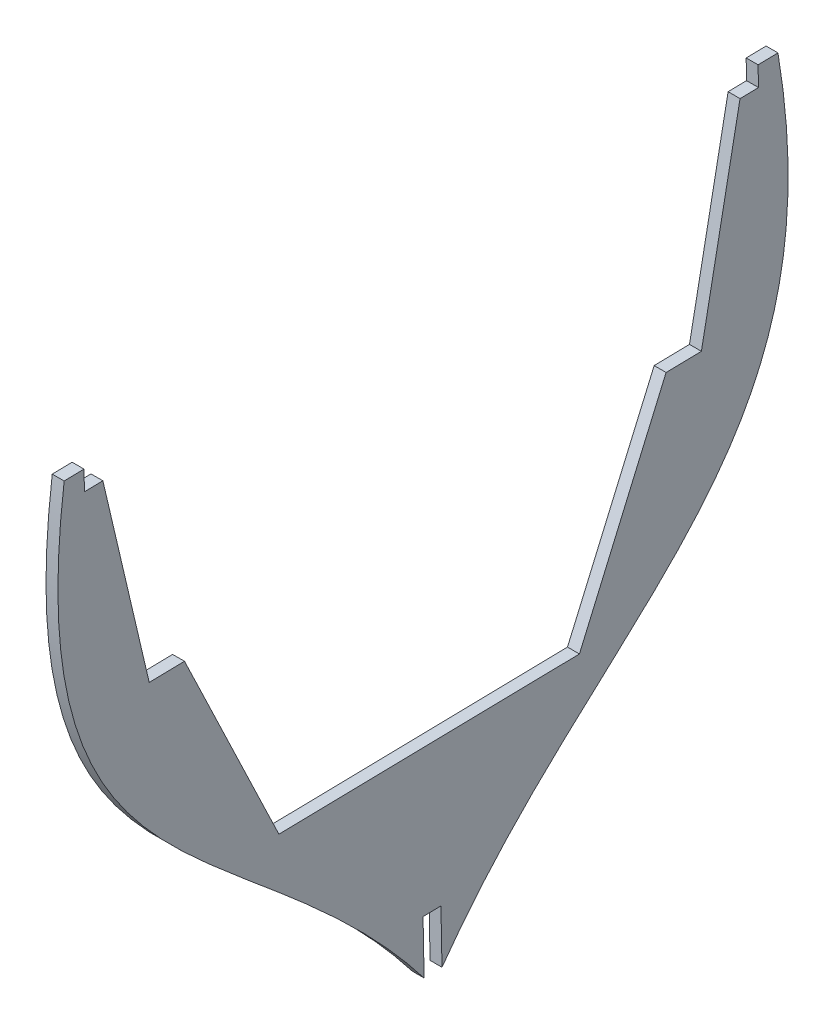
ISO-10303-21;
HEADER;
FILE_DESCRIPTION(('STEP AP214'),'2;1');
FILE_NAME('part.step','',(''),(''),'','','');
FILE_SCHEMA(('AUTOMOTIVE_DESIGN { 1 0 10303 214 1 1 1 1 }'));
ENDSEC;
DATA;
#1=APPLICATION_CONTEXT('core data for automotive mechanical design processes');
#2=APPLICATION_PROTOCOL_DEFINITION('international standard','automotive_design',2000,#1);
#3=PRODUCT_CONTEXT('',#1,'mechanical');
#4=PRODUCT('Part','Part','',(#3));
#5=PRODUCT_RELATED_PRODUCT_CATEGORY('part','',(#4));
#6=PRODUCT_DEFINITION_FORMATION('','',#4);
#7=PRODUCT_DEFINITION_CONTEXT('part definition',#1,'design');
#8=PRODUCT_DEFINITION('design','',#6,#7);
#9=PRODUCT_DEFINITION_SHAPE('','',#8);
#10=(LENGTH_UNIT() NAMED_UNIT(*) SI_UNIT(.MILLI.,.METRE.));
#11=(NAMED_UNIT(*) PLANE_ANGLE_UNIT() SI_UNIT($,.RADIAN.));
#12=(NAMED_UNIT(*) SI_UNIT($,.STERADIAN.) SOLID_ANGLE_UNIT());
#13=UNCERTAINTY_MEASURE_WITH_UNIT(LENGTH_MEASURE(1.E-05),#10,'distance_accuracy_value','');
#14=(GEOMETRIC_REPRESENTATION_CONTEXT(3) GLOBAL_UNCERTAINTY_ASSIGNED_CONTEXT((#13)) GLOBAL_UNIT_ASSIGNED_CONTEXT((#10,
#11,#12)) REPRESENTATION_CONTEXT('',''));
#15=CARTESIAN_POINT('',(0.,0.,0.));
#16=DIRECTION('',(0.,0.,1.));
#17=DIRECTION('',(1.,0.,0.));
#18=AXIS2_PLACEMENT_3D('',#15,#16,#17);
#19=CARTESIAN_POINT('',(6.,343.126909424198,186.314870475177));
#20=CARTESIAN_POINT('',(6.,154.752332035133,210.548845305652));
#21=CARTESIAN_POINT('',(6.,150.28594526059,89.3981040461568));
#22=CARTESIAN_POINT('',(6.,29.8617579876105,0.579687578557194));
#23=B_SPLINE_CURVE_WITH_KNOTS('',3,(#19,#20,#21,#22),.UNSPECIFIED.,.F.,.F.,(4,4),(0.,1.),.UNSPECIFIED.);
#24=DIRECTION('',(-1.,0.,0.));
#25=VECTOR('',#24,1.);
#26=SURFACE_OF_LINEAR_EXTRUSION('',#23,#25);
#27=CARTESIAN_POINT('',(0.,343.126909424198,186.314870475177));
#28=CARTESIAN_POINT('',(0.,154.752332035133,210.548845305652));
#29=CARTESIAN_POINT('',(0.,150.28594526059,89.3981040461568));
#30=CARTESIAN_POINT('',(0.,29.8617579876105,0.579687578557194));
#31=B_SPLINE_CURVE_WITH_KNOTS('',3,(#27,#28,#29,#30),.UNSPECIFIED.,.F.,.F.,(4,4),(0.,1.),.UNSPECIFIED.);
#32=CARTESIAN_POINT('',(0.,343.126909424198,186.314870475177));
#33=VERTEX_POINT('',#32);
#34=CARTESIAN_POINT('',(0.,35.9858061854714,5.19941769585234));
#35=VERTEX_POINT('',#34);
#36=EDGE_CURVE('E179',#33,#35,#31,.T.);
#37=ORIENTED_EDGE('',*,*,#36,.T.);
#38=DIRECTION('',(1.,0.,0.));
#39=VECTOR('',#38,1.);
#40=CARTESIAN_POINT('',(0.,35.9858061854714,5.19941769585234));
#41=LINE('',#40,#39);
#42=CARTESIAN_POINT('',(6.,35.9858061854714,5.19941769585234));
#43=VERTEX_POINT('',#42);
#44=EDGE_CURVE('E185',#35,#43,#41,.T.);
#45=ORIENTED_EDGE('',*,*,#44,.T.);
#46=CARTESIAN_POINT('',(6.,343.126909424198,186.314870475177));
#47=VERTEX_POINT('',#46);
#48=EDGE_CURVE('E219',#47,#43,#23,.T.);
#49=ORIENTED_EDGE('',*,*,#48,.F.);
#50=DIRECTION('',(-1.,0.,0.));
#51=VECTOR('',#50,1.);
#52=CARTESIAN_POINT('',(6.,343.126909424198,186.314870475177));
#53=LINE('',#52,#51);
#54=EDGE_CURVE('E175',#47,#33,#53,.T.);
#55=ORIENTED_EDGE('',*,*,#54,.T.);
#56=EDGE_LOOP('',(#37,#45,#49,#55));
#57=FACE_BOUND('',#56,.T.);
#58=ADVANCED_FACE('F33',(#57),#26,.F.);
#59=CARTESIAN_POINT('',(6.,29.8617579876105,0.579687578557194));
#60=CARTESIAN_POINT('',(6.,153.642271532129,-83.4981361969473));
#61=CARTESIAN_POINT('',(6.,162.807168199814,-204.384261900502));
#62=CARTESIAN_POINT('',(6.,350.099301356133,-172.857704835889));
#63=B_SPLINE_CURVE_WITH_KNOTS('',3,(#59,#60,#61,#62),.UNSPECIFIED.,.F.,.F.,(4,4),(0.,1.),.UNSPECIFIED.);
#64=DIRECTION('',(-1.,0.,0.));
#65=VECTOR('',#64,1.);
#66=SURFACE_OF_LINEAR_EXTRUSION('',#63,#65);
#67=CARTESIAN_POINT('',(6.,36.1604846308514,-3.79888700229607));
#68=VERTEX_POINT('',#67);
#69=CARTESIAN_POINT('',(6.,350.099301356133,-172.857704835889));
#70=VERTEX_POINT('',#69);
#71=EDGE_CURVE('E116',#68,#70,#63,.T.);
#72=ORIENTED_EDGE('',*,*,#71,.F.);
#73=DIRECTION('',(1.,0.,0.));
#74=VECTOR('',#73,1.);
#75=CARTESIAN_POINT('',(0.,36.1604846308514,-3.79888700229607));
#76=LINE('',#75,#74);
#77=CARTESIAN_POINT('',(0.,36.1604846308514,-3.79888700229607));
#78=VERTEX_POINT('',#77);
#79=EDGE_CURVE('E311',#78,#68,#76,.T.);
#80=ORIENTED_EDGE('',*,*,#79,.F.);
#81=CARTESIAN_POINT('',(0.,29.8617579876105,0.579687578557194));
#82=CARTESIAN_POINT('',(0.,153.642271532129,-83.4981361969473));
#83=CARTESIAN_POINT('',(0.,162.807168199814,-204.384261900502));
#84=CARTESIAN_POINT('',(0.,350.099301356133,-172.857704835889));
#85=B_SPLINE_CURVE_WITH_KNOTS('',3,(#81,#82,#83,#84),.UNSPECIFIED.,.F.,.F.,(4,4),(0.,1.),.UNSPECIFIED.);
#86=CARTESIAN_POINT('',(0.,350.099301356133,-172.857704835889));
#87=VERTEX_POINT('',#86);
#88=EDGE_CURVE('E184',#78,#87,#85,.T.);
#89=ORIENTED_EDGE('',*,*,#88,.T.);
#90=DIRECTION('',(-1.,0.,0.));
#91=VECTOR('',#90,1.);
#92=CARTESIAN_POINT('',(6.,350.099301356133,-172.857704835889));
#93=LINE('',#92,#91);
#94=EDGE_CURVE('E11',#70,#87,#93,.T.);
#95=ORIENTED_EDGE('',*,*,#94,.F.);
#96=EDGE_LOOP('',(#72,#80,#89,#95));
#97=FACE_BOUND('',#96,.T.);
#98=ADVANCED_FACE('F323',(#97),#66,.F.);
#99=CARTESIAN_POINT('',(6.,350.099301356133,-172.857704835889));
#100=DIRECTION('',(0.,-0.9998116331276,-0.0194087161533295));
#101=DIRECTION('',(0.,0.0194087161533295,-0.9998116331276));
#102=AXIS2_PLACEMENT_3D('',#99,#100,#101);
#103=PLANE('',#102);
#104=DIRECTION('',(0.,-0.0194087161533295,0.9998116331276));
#105=VECTOR('',#104,1.);
#106=CARTESIAN_POINT('',(0.,350.099301356133,-172.857704835889));
#107=LINE('',#106,#105);
#108=CARTESIAN_POINT('',(0.,349.9052141946,-162.859588504613));
#109=VERTEX_POINT('',#108);
#110=EDGE_CURVE('E192',#87,#109,#107,.T.);
#111=ORIENTED_EDGE('',*,*,#110,.T.);
#112=DIRECTION('',(-1.,0.,0.));
#113=VECTOR('',#112,1.);
#114=CARTESIAN_POINT('',(6.,349.9052141946,-162.859588504613));
#115=LINE('',#114,#113);
#116=CARTESIAN_POINT('',(6.,349.9052141946,-162.859588504613));
#117=VERTEX_POINT('',#116);
#118=EDGE_CURVE('E41',#117,#109,#115,.T.);
#119=ORIENTED_EDGE('',*,*,#118,.F.);
#120=DIRECTION('',(0.,-0.0194087161533295,0.9998116331276));
#121=VECTOR('',#120,1.);
#122=CARTESIAN_POINT('',(6.,350.099301356133,-172.857704835889));
#123=LINE('',#122,#121);
#124=EDGE_CURVE('E305',#70,#117,#123,.T.);
#125=ORIENTED_EDGE('',*,*,#124,.F.);
#126=ORIENTED_EDGE('',*,*,#94,.T.);
#127=EDGE_LOOP('',(#111,#119,#125,#126));
#128=FACE_BOUND('',#127,.T.);
#129=ADVANCED_FACE('F326',(#128),#103,.F.);
#130=CARTESIAN_POINT('',(6.,349.9052141946,-162.859588504613));
#131=DIRECTION('',(0.,0.0194087161533324,-0.9998116331276));
#132=DIRECTION('',(0.,0.9998116331276,0.0194087161533324));
#133=AXIS2_PLACEMENT_3D('',#130,#131,#132);
#134=PLANE('',#133);
#135=DIRECTION('',(0.,-0.9998116331276,-0.0194087161533324));
#136=VECTOR('',#135,1.);
#137=CARTESIAN_POINT('',(0.,349.9052141946,-162.859588504613));
#138=LINE('',#137,#136);
#139=CARTESIAN_POINT('',(0.,339.907097863324,-163.053675666146));
#140=VERTEX_POINT('',#139);
#141=EDGE_CURVE('E197',#109,#140,#138,.T.);
#142=ORIENTED_EDGE('',*,*,#141,.T.);
#143=DIRECTION('',(-1.,0.,0.));
#144=VECTOR('',#143,1.);
#145=CARTESIAN_POINT('',(6.,339.907097863324,-163.053675666146));
#146=LINE('',#145,#144);
#147=CARTESIAN_POINT('',(6.,339.907097863324,-163.053675666146));
#148=VERTEX_POINT('',#147);
#149=EDGE_CURVE('E244',#148,#140,#146,.T.);
#150=ORIENTED_EDGE('',*,*,#149,.F.);
#151=DIRECTION('',(0.,-0.9998116331276,-0.0194087161533324));
#152=VECTOR('',#151,1.);
#153=CARTESIAN_POINT('',(6.,349.9052141946,-162.859588504613));
#154=LINE('',#153,#152);
#155=EDGE_CURVE('E253',#117,#148,#154,.T.);
#156=ORIENTED_EDGE('',*,*,#155,.F.);
#157=ORIENTED_EDGE('',*,*,#118,.T.);
#158=EDGE_LOOP('',(#142,#150,#156,#157));
#159=FACE_BOUND('',#158,.T.);
#160=ADVANCED_FACE('F251',(#159),#134,.F.);
#161=CARTESIAN_POINT('',(6.,339.907097863324,-163.053675666146));
#162=DIRECTION('',(0.,-0.9998116331276,-0.0194087161533287));
#163=DIRECTION('',(0.,0.0194087161533287,-0.999811633127601));
#164=AXIS2_PLACEMENT_3D('',#161,#162,#163);
#165=PLANE('',#164);
#166=DIRECTION('',(0.,-0.0194087161533287,0.9998116331276));
#167=VECTOR('',#166,1.);
#168=CARTESIAN_POINT('',(0.,339.907097863324,-163.053675666146));
#169=LINE('',#168,#167);
#170=CARTESIAN_POINT('',(0.,339.727026893814,-153.777582972391));
#171=VERTEX_POINT('',#170);
#172=EDGE_CURVE('E199',#140,#171,#169,.T.);
#173=ORIENTED_EDGE('',*,*,#172,.T.);
#174=DIRECTION('',(-1.,0.,0.));
#175=VECTOR('',#174,1.);
#176=CARTESIAN_POINT('',(6.,339.727026893814,-153.777582972391));
#177=LINE('',#176,#175);
#178=CARTESIAN_POINT('',(6.,339.727026893814,-153.777582972391));
#179=VERTEX_POINT('',#178);
#180=EDGE_CURVE('E241',#179,#171,#177,.T.);
#181=ORIENTED_EDGE('',*,*,#180,.F.);
#182=DIRECTION('',(0.,-0.0194087161533287,0.9998116331276));
#183=VECTOR('',#182,1.);
#184=CARTESIAN_POINT('',(6.,339.907097863324,-163.053675666146));
#185=LINE('',#184,#183);
#186=EDGE_CURVE('E275',#148,#179,#185,.T.);
#187=ORIENTED_EDGE('',*,*,#186,.F.);
#188=ORIENTED_EDGE('',*,*,#149,.T.);
#189=EDGE_LOOP('',(#173,#181,#187,#188));
#190=FACE_BOUND('',#189,.T.);
#191=ADVANCED_FACE('F266',(#190),#165,.F.);
#192=CARTESIAN_POINT('',(6.,339.727026893814,-153.777582972391));
#193=DIRECTION('',(0.,-0.190163184206435,-0.981752495984843));
#194=DIRECTION('',(0.,0.981752495984843,-0.190163184206435));
#195=AXIS2_PLACEMENT_3D('',#192,#193,#194);
#196=PLANE('',#195);
#197=DIRECTION('',(0.,-0.981752495984843,0.190163184206435));
#198=VECTOR('',#197,1.);
#199=CARTESIAN_POINT('',(0.,339.727026893814,-153.777582972391));
#200=LINE('',#199,#198);
#201=CARTESIAN_POINT('',(0.,239.330683188979,-134.331043768593));
#202=VERTEX_POINT('',#201);
#203=EDGE_CURVE('E201',#171,#202,#200,.T.);
#204=ORIENTED_EDGE('',*,*,#203,.T.);
#205=DIRECTION('',(-1.,0.,0.));
#206=VECTOR('',#205,1.);
#207=CARTESIAN_POINT('',(6.,239.330683188979,-134.331043768593));
#208=LINE('',#207,#206);
#209=CARTESIAN_POINT('',(6.,239.330683188979,-134.331043768593));
#210=VERTEX_POINT('',#209);
#211=EDGE_CURVE('E238',#210,#202,#208,.T.);
#212=ORIENTED_EDGE('',*,*,#211,.F.);
#213=DIRECTION('',(0.,-0.981752495984843,0.190163184206435));
#214=VECTOR('',#213,1.);
#215=CARTESIAN_POINT('',(6.,339.727026893814,-153.777582972391));
#216=LINE('',#215,#214);
#217=EDGE_CURVE('E272',#179,#210,#216,.T.);
#218=ORIENTED_EDGE('',*,*,#217,.F.);
#219=ORIENTED_EDGE('',*,*,#180,.T.);
#220=EDGE_LOOP('',(#204,#212,#218,#219));
#221=FACE_BOUND('',#220,.T.);
#222=ADVANCED_FACE('F270',(#221),#196,.F.);
#223=CARTESIAN_POINT('',(6.,239.330683188979,-134.331043768593));
#224=DIRECTION('',(0.,-0.9998116331276,-0.0194087161533319));
#225=DIRECTION('',(0.,0.0194087161533319,-0.9998116331276));
#226=AXIS2_PLACEMENT_3D('',#223,#224,#225);
#227=PLANE('',#226);
#228=DIRECTION('',(0.,-0.0194087161533319,0.9998116331276));
#229=VECTOR('',#228,1.);
#230=CARTESIAN_POINT('',(0.,239.330683188979,-134.331043768593));
#231=LINE('',#230,#229);
#232=CARTESIAN_POINT('',(0.,238.985752103347,-116.562423252063));
#233=VERTEX_POINT('',#232);
#234=EDGE_CURVE('E203',#202,#233,#231,.T.);
#235=ORIENTED_EDGE('',*,*,#234,.T.);
#236=DIRECTION('',(-1.,0.,0.));
#237=VECTOR('',#236,1.);
#238=CARTESIAN_POINT('',(6.,238.985752103347,-116.562423252063));
#239=LINE('',#238,#237);
#240=CARTESIAN_POINT('',(6.,238.985752103347,-116.562423252063));
#241=VERTEX_POINT('',#240);
#242=EDGE_CURVE('E235',#241,#233,#239,.T.);
#243=ORIENTED_EDGE('',*,*,#242,.F.);
#244=DIRECTION('',(0.,-0.0194087161533319,0.9998116331276));
#245=VECTOR('',#244,1.);
#246=CARTESIAN_POINT('',(6.,239.330683188979,-134.331043768593));
#247=LINE('',#246,#245);
#248=EDGE_CURVE('E274',#210,#241,#247,.T.);
#249=ORIENTED_EDGE('',*,*,#248,.F.);
#250=ORIENTED_EDGE('',*,*,#211,.T.);
#251=EDGE_LOOP('',(#235,#243,#249,#250));
#252=FACE_BOUND('',#251,.T.);
#253=ADVANCED_FACE('F336',(#252),#227,.F.);
#254=CARTESIAN_POINT('',(6.,238.985752103347,-116.562423252063));
#255=DIRECTION('',(0.,-0.396834949973152,-0.917889983865063));
#256=DIRECTION('',(0.,0.917889983865063,-0.396834949973152));
#257=AXIS2_PLACEMENT_3D('',#254,#255,#256);
#258=PLANE('',#257);
#259=DIRECTION('',(0.,-0.917889983865063,0.396834949973152));
#260=VECTOR('',#259,1.);
#261=CARTESIAN_POINT('',(0.,238.985752103347,-116.562423252063));
#262=LINE('',#261,#260);
#263=CARTESIAN_POINT('',(0.,138.120386506465,-72.9549070853464));
#264=VERTEX_POINT('',#263);
#265=EDGE_CURVE('E205',#233,#264,#262,.T.);
#266=ORIENTED_EDGE('',*,*,#265,.T.);
#267=DIRECTION('',(-1.,0.,0.));
#268=VECTOR('',#267,1.);
#269=CARTESIAN_POINT('',(6.,138.120386506465,-72.9549070853464));
#270=LINE('',#269,#268);
#271=CARTESIAN_POINT('',(6.,138.120386506465,-72.9549070853464));
#272=VERTEX_POINT('',#271);
#273=EDGE_CURVE('E232',#272,#264,#270,.T.);
#274=ORIENTED_EDGE('',*,*,#273,.F.);
#275=DIRECTION('',(0.,-0.917889983865063,0.396834949973152));
#276=VECTOR('',#275,1.);
#277=CARTESIAN_POINT('',(6.,238.985752103347,-116.562423252063));
#278=LINE('',#277,#276);
#279=EDGE_CURVE('E277',#241,#272,#278,.T.);
#280=ORIENTED_EDGE('',*,*,#279,.F.);
#281=ORIENTED_EDGE('',*,*,#242,.T.);
#282=EDGE_LOOP('',(#266,#274,#280,#281));
#283=FACE_BOUND('',#282,.T.);
#284=ADVANCED_FACE('F339',(#283),#258,.F.);
#285=CARTESIAN_POINT('',(6.,135.184938360275,78.2604119402354));
#286=DIRECTION('',(0.,-0.9998116331276,-0.0194087161533328));
#287=DIRECTION('',(0.,0.0194087161533328,-0.9998116331276));
#288=AXIS2_PLACEMENT_3D('',#285,#286,#287);
#289=PLANE('',#288);
#290=DIRECTION('',(0.,-0.0194087161533328,0.9998116331276));
#291=VECTOR('',#290,1.);
#292=CARTESIAN_POINT('',(0.,135.184938360275,78.2604119402354));
#293=LINE('',#292,#291);
#294=CARTESIAN_POINT('',(0.,135.184938360275,78.2604119402354));
#295=VERTEX_POINT('',#294);
#296=EDGE_CURVE('E207',#264,#295,#293,.T.);
#297=ORIENTED_EDGE('',*,*,#296,.T.);
#298=DIRECTION('',(-1.,0.,0.));
#299=VECTOR('',#298,1.);
#300=CARTESIAN_POINT('',(6.,135.184938360275,78.2604119402354));
#301=LINE('',#300,#299);
#302=CARTESIAN_POINT('',(6.,135.184938360275,78.2604119402354));
#303=VERTEX_POINT('',#302);
#304=EDGE_CURVE('E229',#303,#295,#301,.T.);
#305=ORIENTED_EDGE('',*,*,#304,.F.);
#306=DIRECTION('',(0.,-0.0194087161533328,0.9998116331276));
#307=VECTOR('',#306,1.);
#308=CARTESIAN_POINT('',(6.,135.184938360275,78.2604119402354));
#309=LINE('',#308,#307);
#310=EDGE_CURVE('E283',#272,#303,#309,.T.);
#311=ORIENTED_EDGE('',*,*,#310,.F.);
#312=ORIENTED_EDGE('',*,*,#273,.T.);
#313=EDGE_LOOP('',(#297,#305,#311,#312));
#314=FACE_BOUND('',#313,.T.);
#315=ADVANCED_FACE('F343',(#314),#289,.F.);
#316=CARTESIAN_POINT('',(6.,234.281899388912,125.749671337618));
#317=DIRECTION('',(0.,-0.43215939667773,0.90179723655772));
#318=DIRECTION('',(0.,-0.90179723655772,-0.43215939667773));
#319=AXIS2_PLACEMENT_3D('',#316,#317,#318);
#320=PLANE('',#319);
#321=DIRECTION('',(0.,0.90179723655772,0.43215939667773));
#322=VECTOR('',#321,1.);
#323=CARTESIAN_POINT('',(0.,234.281899388912,125.749671337618));
#324=LINE('',#323,#322);
#325=CARTESIAN_POINT('',(0.,234.281899388912,125.749671337618));
#326=VERTEX_POINT('',#325);
#327=EDGE_CURVE('E209',#295,#326,#324,.T.);
#328=ORIENTED_EDGE('',*,*,#327,.T.);
#329=DIRECTION('',(-1.,0.,0.));
#330=VECTOR('',#329,1.);
#331=CARTESIAN_POINT('',(6.,234.281899388912,125.749671337618));
#332=LINE('',#331,#330);
#333=CARTESIAN_POINT('',(6.,234.281899388912,125.749671337618));
#334=VERTEX_POINT('',#333);
#335=EDGE_CURVE('E226',#334,#326,#332,.T.);
#336=ORIENTED_EDGE('',*,*,#335,.F.);
#337=DIRECTION('',(0.,0.90179723655772,0.43215939667773));
#338=VECTOR('',#337,1.);
#339=CARTESIAN_POINT('',(6.,234.281899388912,125.749671337618));
#340=LINE('',#339,#338);
#341=EDGE_CURVE('E285',#303,#334,#340,.T.);
#342=ORIENTED_EDGE('',*,*,#341,.F.);
#343=ORIENTED_EDGE('',*,*,#304,.T.);
#344=EDGE_LOOP('',(#328,#336,#342,#343));
#345=FACE_BOUND('',#344,.T.);
#346=ADVANCED_FACE('F347',(#345),#320,.F.);
#347=CARTESIAN_POINT('',(6.,233.936968303281,143.518291854149));
#348=DIRECTION('',(0.,-0.9998116331276,-0.0194087161533335));
#349=DIRECTION('',(0.,0.0194087161533335,-0.9998116331276));
#350=AXIS2_PLACEMENT_3D('',#347,#348,#349);
#351=PLANE('',#350);
#352=DIRECTION('',(0.,-0.0194087161533335,0.9998116331276));
#353=VECTOR('',#352,1.);
#354=CARTESIAN_POINT('',(0.,233.936968303281,143.518291854149));
#355=LINE('',#354,#353);
#356=CARTESIAN_POINT('',(0.,233.936968303281,143.518291854149));
#357=VERTEX_POINT('',#356);
#358=EDGE_CURVE('E211',#326,#357,#355,.T.);
#359=ORIENTED_EDGE('',*,*,#358,.T.);
#360=DIRECTION('',(-1.,0.,0.));
#361=VECTOR('',#360,1.);
#362=CARTESIAN_POINT('',(6.,233.936968303281,143.518291854149));
#363=LINE('',#362,#361);
#364=CARTESIAN_POINT('',(6.,233.936968303281,143.518291854149));
#365=VERTEX_POINT('',#364);
#366=EDGE_CURVE('E223',#365,#357,#363,.T.);
#367=ORIENTED_EDGE('',*,*,#366,.F.);
#368=DIRECTION('',(0.,-0.0194087161533335,0.9998116331276));
#369=VECTOR('',#368,1.);
#370=CARTESIAN_POINT('',(6.,233.936968303281,143.518291854149));
#371=LINE('',#370,#369);
#372=EDGE_CURVE('E287',#334,#365,#371,.T.);
#373=ORIENTED_EDGE('',*,*,#372,.F.);
#374=ORIENTED_EDGE('',*,*,#335,.T.);
#375=EDGE_LOOP('',(#359,#367,#373,#374));
#376=FACE_BOUND('',#375,.T.);
#377=ADVANCED_FACE('F293',(#376),#351,.F.);
#378=CARTESIAN_POINT('',(6.,333.502951223966,166.846574288613));
#379=DIRECTION('',(0.,-0.228121848484919,0.973632590993042));
#380=DIRECTION('',(0.,-0.973632590993042,-0.228121848484919));
#381=AXIS2_PLACEMENT_3D('',#378,#379,#380);
#382=PLANE('',#381);
#383=DIRECTION('',(0.,0.973632590993042,0.228121848484919));
#384=VECTOR('',#383,1.);
#385=CARTESIAN_POINT('',(0.,333.502951223966,166.846574288613));
#386=LINE('',#385,#384);
#387=CARTESIAN_POINT('',(0.,333.502951223966,166.846574288613));
#388=VERTEX_POINT('',#387);
#389=EDGE_CURVE('E213',#357,#388,#386,.T.);
#390=ORIENTED_EDGE('',*,*,#389,.T.);
#391=DIRECTION('',(-1.,0.,0.));
#392=VECTOR('',#391,1.);
#393=CARTESIAN_POINT('',(6.,333.502951223966,166.846574288613));
#394=LINE('',#393,#392);
#395=CARTESIAN_POINT('',(6.,333.502951223966,166.846574288613));
#396=VERTEX_POINT('',#395);
#397=EDGE_CURVE('E170',#396,#388,#394,.T.);
#398=ORIENTED_EDGE('',*,*,#397,.F.);
#399=DIRECTION('',(0.,0.973632590993042,0.228121848484919));
#400=VECTOR('',#399,1.);
#401=CARTESIAN_POINT('',(6.,333.502951223966,166.846574288613));
#402=LINE('',#401,#400);
#403=EDGE_CURVE('E158',#365,#396,#402,.T.);
#404=ORIENTED_EDGE('',*,*,#403,.F.);
#405=ORIENTED_EDGE('',*,*,#366,.T.);
#406=EDGE_LOOP('',(#390,#398,#404,#405));
#407=FACE_BOUND('',#406,.T.);
#408=ADVANCED_FACE('F297',(#407),#382,.F.);
#409=CARTESIAN_POINT('',(6.,333.322880254455,176.122666982368));
#410=DIRECTION('',(0.,-0.9998116331276,-0.0194087161533345));
#411=DIRECTION('',(0.,0.0194087161533345,-0.9998116331276));
#412=AXIS2_PLACEMENT_3D('',#409,#410,#411);
#413=PLANE('',#412);
#414=DIRECTION('',(0.,-0.0194087161533345,0.9998116331276));
#415=VECTOR('',#414,1.);
#416=CARTESIAN_POINT('',(0.,333.322880254455,176.122666982368));
#417=LINE('',#416,#415);
#418=CARTESIAN_POINT('',(0.,333.322880254455,176.122666982368));
#419=VERTEX_POINT('',#418);
#420=EDGE_CURVE('E167',#388,#419,#417,.T.);
#421=ORIENTED_EDGE('',*,*,#420,.T.);
#422=DIRECTION('',(-1.,0.,0.));
#423=VECTOR('',#422,1.);
#424=CARTESIAN_POINT('',(6.,333.322880254455,176.122666982368));
#425=LINE('',#424,#423);
#426=CARTESIAN_POINT('',(6.,333.322880254455,176.122666982368));
#427=VERTEX_POINT('',#426);
#428=EDGE_CURVE('E164',#427,#419,#425,.T.);
#429=ORIENTED_EDGE('',*,*,#428,.F.);
#430=DIRECTION('',(0.,-0.0194087161533345,0.9998116331276));
#431=VECTOR('',#430,1.);
#432=CARTESIAN_POINT('',(6.,333.322880254455,176.122666982368));
#433=LINE('',#432,#431);
#434=EDGE_CURVE('E151',#396,#427,#433,.T.);
#435=ORIENTED_EDGE('',*,*,#434,.F.);
#436=ORIENTED_EDGE('',*,*,#397,.T.);
#437=EDGE_LOOP('',(#421,#429,#435,#436));
#438=FACE_BOUND('',#437,.T.);
#439=ADVANCED_FACE('F165',(#438),#413,.F.);
#440=CARTESIAN_POINT('',(6.,343.320996585731,176.316754143901));
#441=DIRECTION('',(0.,-0.0194087161533324,0.9998116331276));
#442=DIRECTION('',(0.,-0.9998116331276,-0.0194087161533324));
#443=AXIS2_PLACEMENT_3D('',#440,#441,#442);
#444=PLANE('',#443);
#445=DIRECTION('',(0.,0.9998116331276,0.0194087161533324));
#446=VECTOR('',#445,1.);
#447=CARTESIAN_POINT('',(0.,343.320996585731,176.316754143901));
#448=LINE('',#447,#446);
#449=CARTESIAN_POINT('',(0.,343.320996585731,176.316754143901));
#450=VERTEX_POINT('',#449);
#451=EDGE_CURVE('E216',#419,#450,#448,.T.);
#452=ORIENTED_EDGE('',*,*,#451,.T.);
#453=DIRECTION('',(-1.,0.,0.));
#454=VECTOR('',#453,1.);
#455=CARTESIAN_POINT('',(6.,343.320996585731,176.316754143901));
#456=LINE('',#455,#454);
#457=CARTESIAN_POINT('',(6.,343.320996585731,176.316754143901));
#458=VERTEX_POINT('',#457);
#459=EDGE_CURVE('E171',#458,#450,#456,.T.);
#460=ORIENTED_EDGE('',*,*,#459,.F.);
#461=DIRECTION('',(0.,0.9998116331276,0.0194087161533324));
#462=VECTOR('',#461,1.);
#463=CARTESIAN_POINT('',(6.,343.320996585731,176.316754143901));
#464=LINE('',#463,#462);
#465=EDGE_CURVE('E155',#427,#458,#464,.T.);
#466=ORIENTED_EDGE('',*,*,#465,.F.);
#467=ORIENTED_EDGE('',*,*,#428,.T.);
#468=EDGE_LOOP('',(#452,#460,#466,#467));
#469=FACE_BOUND('',#468,.T.);
#470=ADVANCED_FACE('F173',(#469),#444,.F.);
#471=CARTESIAN_POINT('',(6.,343.126909424198,186.314870475177));
#472=DIRECTION('',(0.,-0.9998116331276,-0.0194087161533352));
#473=DIRECTION('',(0.,0.0194087161533352,-0.9998116331276));
#474=AXIS2_PLACEMENT_3D('',#471,#472,#473);
#475=PLANE('',#474);
#476=DIRECTION('',(0.,-0.0194087161533352,0.9998116331276));
#477=VECTOR('',#476,1.);
#478=CARTESIAN_POINT('',(0.,343.126909424198,186.314870475177));
#479=LINE('',#478,#477);
#480=EDGE_CURVE('E108',#450,#33,#479,.T.);
#481=ORIENTED_EDGE('',*,*,#480,.T.);
#482=ORIENTED_EDGE('',*,*,#54,.F.);
#483=DIRECTION('',(0.,-0.0194087161533352,0.9998116331276));
#484=VECTOR('',#483,1.);
#485=CARTESIAN_POINT('',(6.,343.126909424198,186.314870475177));
#486=LINE('',#485,#484);
#487=EDGE_CURVE('E57',#458,#47,#486,.T.);
#488=ORIENTED_EDGE('',*,*,#487,.F.);
#489=ORIENTED_EDGE('',*,*,#459,.T.);
#490=EDGE_LOOP('',(#481,#482,#488,#489));
#491=FACE_BOUND('',#490,.T.);
#492=ADVANCED_FACE('F299',(#491),#475,.F.);
#493=CARTESIAN_POINT('',(6.,161.012937412372,135.841925763645));
#494=DIRECTION('',(-1.,0.,0.));
#495=DIRECTION('',(0.,0.,1.));
#496=AXIS2_PLACEMENT_3D('',#493,#494,#495);
#497=PLANE('',#496);
#498=ORIENTED_EDGE('',*,*,#48,.T.);
#499=DIRECTION('',(0.,-0.9998116331276,-0.0194087161533328));
#500=VECTOR('',#499,1.);
#501=CARTESIAN_POINT('',(6.,35.9858061854714,5.19941769585234));
#502=LINE('',#501,#500);
#503=CARTESIAN_POINT('',(6.,62.9807202799166,5.72345303199233));
#504=VERTEX_POINT('',#503);
#505=EDGE_CURVE('E499',#504,#43,#502,.T.);
#506=ORIENTED_EDGE('',*,*,#505,.F.);
#507=DIRECTION('',(0.,-0.0194087161533327,0.9998116331276));
#508=VECTOR('',#507,1.);
#509=CARTESIAN_POINT('',(6.,62.9807202799166,5.72345303199233));
#510=LINE('',#509,#508);
#511=CARTESIAN_POINT('',(6.,63.1553987252966,-3.27485166615608));
#512=VERTEX_POINT('',#511);
#513=EDGE_CURVE('E507',#512,#504,#510,.T.);
#514=ORIENTED_EDGE('',*,*,#513,.F.);
#515=DIRECTION('',(0.,0.9998116331276,0.0194087161533329));
#516=VECTOR('',#515,1.);
#517=CARTESIAN_POINT('',(6.,63.1553987252966,-3.27485166615608));
#518=LINE('',#517,#516);
#519=EDGE_CURVE('E511',#68,#512,#518,.T.);
#520=ORIENTED_EDGE('',*,*,#519,.F.);
#521=ORIENTED_EDGE('',*,*,#71,.T.);
#522=ORIENTED_EDGE('',*,*,#124,.T.);
#523=ORIENTED_EDGE('',*,*,#155,.T.);
#524=ORIENTED_EDGE('',*,*,#186,.T.);
#525=ORIENTED_EDGE('',*,*,#217,.T.);
#526=ORIENTED_EDGE('',*,*,#248,.T.);
#527=ORIENTED_EDGE('',*,*,#279,.T.);
#528=ORIENTED_EDGE('',*,*,#310,.T.);
#529=ORIENTED_EDGE('',*,*,#341,.T.);
#530=ORIENTED_EDGE('',*,*,#372,.T.);
#531=ORIENTED_EDGE('',*,*,#403,.T.);
#532=ORIENTED_EDGE('',*,*,#434,.T.);
#533=ORIENTED_EDGE('',*,*,#465,.T.);
#534=ORIENTED_EDGE('',*,*,#487,.T.);
#535=EDGE_LOOP('',(#498,#506,#514,#520,#521,#522,#523,#524,#525,#526,#527,#528,#529,#530,#531,
#532,#533,#534));
#536=FACE_BOUND('',#535,.T.);
#537=ADVANCED_FACE('F153',(#536),#497,.F.);
#538=CARTESIAN_POINT('',(0.,161.012937412372,135.841925763645));
#539=DIRECTION('',(-1.,0.,0.));
#540=DIRECTION('',(0.,0.,1.));
#541=AXIS2_PLACEMENT_3D('',#538,#539,#540);
#542=PLANE('',#541);
#543=DIRECTION('',(0.,-0.9998116331276,-0.0194087161533328));
#544=VECTOR('',#543,1.);
#545=CARTESIAN_POINT('',(0.,35.9858061854714,5.19941769585234));
#546=LINE('',#545,#544);
#547=CARTESIAN_POINT('',(0.,62.9807202799166,5.72345303199233));
#548=VERTEX_POINT('',#547);
#549=EDGE_CURVE('E520',#548,#35,#546,.T.);
#550=ORIENTED_EDGE('',*,*,#549,.T.);
#551=ORIENTED_EDGE('',*,*,#36,.F.);
#552=ORIENTED_EDGE('',*,*,#480,.F.);
#553=ORIENTED_EDGE('',*,*,#451,.F.);
#554=ORIENTED_EDGE('',*,*,#420,.F.);
#555=ORIENTED_EDGE('',*,*,#389,.F.);
#556=ORIENTED_EDGE('',*,*,#358,.F.);
#557=ORIENTED_EDGE('',*,*,#327,.F.);
#558=ORIENTED_EDGE('',*,*,#296,.F.);
#559=ORIENTED_EDGE('',*,*,#265,.F.);
#560=ORIENTED_EDGE('',*,*,#234,.F.);
#561=ORIENTED_EDGE('',*,*,#203,.F.);
#562=ORIENTED_EDGE('',*,*,#172,.F.);
#563=ORIENTED_EDGE('',*,*,#141,.F.);
#564=ORIENTED_EDGE('',*,*,#110,.F.);
#565=ORIENTED_EDGE('',*,*,#88,.F.);
#566=DIRECTION('',(0.,0.9998116331276,0.0194087161533329));
#567=VECTOR('',#566,1.);
#568=CARTESIAN_POINT('',(0.,63.1553987252966,-3.27485166615608));
#569=LINE('',#568,#567);
#570=CARTESIAN_POINT('',(0.,63.1553987252966,-3.27485166615609));
#571=VERTEX_POINT('',#570);
#572=EDGE_CURVE('E506',#78,#571,#569,.T.);
#573=ORIENTED_EDGE('',*,*,#572,.T.);
#574=DIRECTION('',(0.,-0.0194087161533327,0.9998116331276));
#575=VECTOR('',#574,1.);
#576=CARTESIAN_POINT('',(0.,62.9807202799166,5.72345303199233));
#577=LINE('',#576,#575);
#578=EDGE_CURVE('E48',#571,#548,#577,.T.);
#579=ORIENTED_EDGE('',*,*,#578,.T.);
#580=EDGE_LOOP('',(#550,#551,#552,#553,#554,#555,#556,#557,#558,#559,#560,#561,#562,#563,#564,
#565,#573,#579));
#581=FACE_BOUND('',#580,.T.);
#582=ADVANCED_FACE('F260',(#581),#542,.T.);
#583=CARTESIAN_POINT('',(0.,35.9858061854714,5.19941769585234));
#584=DIRECTION('',(0.,-0.0194087161533328,0.9998116331276));
#585=DIRECTION('',(0.,-0.9998116331276,-0.0194087161533328));
#586=AXIS2_PLACEMENT_3D('',#583,#584,#585);
#587=PLANE('',#586);
#588=ORIENTED_EDGE('',*,*,#505,.T.);
#589=ORIENTED_EDGE('',*,*,#44,.F.);
#590=ORIENTED_EDGE('',*,*,#549,.F.);
#591=DIRECTION('',(1.,0.,0.));
#592=VECTOR('',#591,1.);
#593=CARTESIAN_POINT('',(0.,62.9807202799166,5.72345303199233));
#594=LINE('',#593,#592);
#595=EDGE_CURVE('E502',#548,#504,#594,.T.);
#596=ORIENTED_EDGE('',*,*,#595,.T.);
#597=EDGE_LOOP('',(#588,#589,#590,#596));
#598=FACE_BOUND('',#597,.T.);
#599=ADVANCED_FACE('F364',(#598),#587,.F.);
#600=CARTESIAN_POINT('',(0.,62.9807202799166,5.72345303199233));
#601=DIRECTION('',(0.,0.9998116331276,0.0194087161533327));
#602=DIRECTION('',(0.,-0.0194087161533327,0.9998116331276));
#603=AXIS2_PLACEMENT_3D('',#600,#601,#602);
#604=PLANE('',#603);
#605=ORIENTED_EDGE('',*,*,#513,.T.);
#606=ORIENTED_EDGE('',*,*,#595,.F.);
#607=ORIENTED_EDGE('',*,*,#578,.F.);
#608=DIRECTION('',(1.,0.,0.));
#609=VECTOR('',#608,1.);
#610=CARTESIAN_POINT('',(0.,63.1553987252966,-3.27485166615608));
#611=LINE('',#610,#609);
#612=EDGE_CURVE('E516',#571,#512,#611,.T.);
#613=ORIENTED_EDGE('',*,*,#612,.T.);
#614=EDGE_LOOP('',(#605,#606,#607,#613));
#615=FACE_BOUND('',#614,.T.);
#616=ADVANCED_FACE('F370',(#615),#604,.F.);
#617=CARTESIAN_POINT('',(0.,63.1553987252966,-3.27485166615608));
#618=DIRECTION('',(0.,0.0194087161533329,-0.9998116331276));
#619=DIRECTION('',(0.,0.9998116331276,0.0194087161533329));
#620=AXIS2_PLACEMENT_3D('',#617,#618,#619);
#621=PLANE('',#620);
#622=ORIENTED_EDGE('',*,*,#519,.T.);
#623=ORIENTED_EDGE('',*,*,#612,.F.);
#624=ORIENTED_EDGE('',*,*,#572,.F.);
#625=ORIENTED_EDGE('',*,*,#79,.T.);
#626=EDGE_LOOP('',(#622,#623,#624,#625));
#627=FACE_BOUND('',#626,.T.);
#628=ADVANCED_FACE('F367',(#627),#621,.F.);
#629=CLOSED_SHELL('',(#58,#98,#129,#160,#191,#222,#253,#284,#315,#346,#377,#408,#439,#470,#492,
#537,#582,#599,#616,#628));
#630=MANIFOLD_SOLID_BREP('B2',#629);
#631=ADVANCED_BREP_SHAPE_REPRESENTATION('',(#18,#630),#14);
#632=SHAPE_DEFINITION_REPRESENTATION(#9,#631);
ENDSEC;
END-ISO-10303-21;
